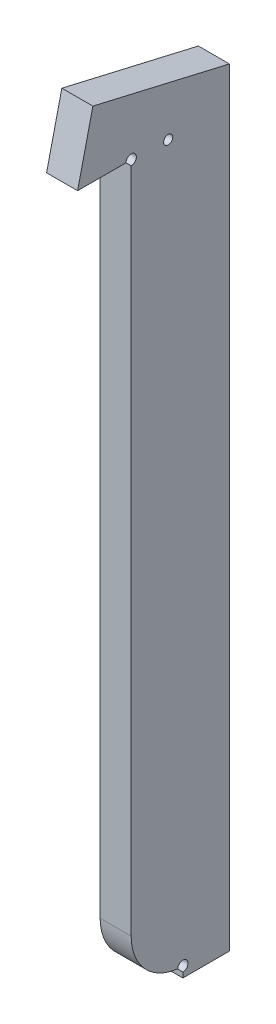
ISO-10303-21;
HEADER;
FILE_DESCRIPTION(('STEP AP214'),'2;1');
FILE_NAME('part.step','',(''),(''),'','','');
FILE_SCHEMA(('AUTOMOTIVE_DESIGN { 1 0 10303 214 1 1 1 1 }'));
ENDSEC;
DATA;
#1=APPLICATION_CONTEXT('core data for automotive mechanical design processes');
#2=APPLICATION_PROTOCOL_DEFINITION('international standard','automotive_design',2000,#1);
#3=PRODUCT_CONTEXT('',#1,'mechanical');
#4=PRODUCT('Part','Part','',(#3));
#5=PRODUCT_RELATED_PRODUCT_CATEGORY('part','',(#4));
#6=PRODUCT_DEFINITION_FORMATION('','',#4);
#7=PRODUCT_DEFINITION_CONTEXT('part definition',#1,'design');
#8=PRODUCT_DEFINITION('design','',#6,#7);
#9=PRODUCT_DEFINITION_SHAPE('','',#8);
#10=(LENGTH_UNIT() NAMED_UNIT(*) SI_UNIT(.MILLI.,.METRE.));
#11=(NAMED_UNIT(*) PLANE_ANGLE_UNIT() SI_UNIT($,.RADIAN.));
#12=(NAMED_UNIT(*) SI_UNIT($,.STERADIAN.) SOLID_ANGLE_UNIT());
#13=UNCERTAINTY_MEASURE_WITH_UNIT(LENGTH_MEASURE(1.E-05),#10,'distance_accuracy_value','');
#14=(GEOMETRIC_REPRESENTATION_CONTEXT(3) GLOBAL_UNCERTAINTY_ASSIGNED_CONTEXT((#13)) GLOBAL_UNIT_ASSIGNED_CONTEXT((#10,
#11,#12)) REPRESENTATION_CONTEXT('',''));
#15=CARTESIAN_POINT('',(0.,0.,0.));
#16=DIRECTION('',(0.,0.,1.));
#17=DIRECTION('',(1.,0.,0.));
#18=AXIS2_PLACEMENT_3D('',#15,#16,#17);
#19=CARTESIAN_POINT('',(-228.088766336441,1.77635683940025E-12,66.675));
#20=DIRECTION('',(1.,0.,0.));
#21=DIRECTION('',(0.,1.,0.));
#22=AXIS2_PLACEMENT_3D('',#19,#20,#21);
#23=PLANE('',#22);
#24=CARTESIAN_POINT('',(-228.088766336441,-0.660555348845376,37.580125219567));
#25=DIRECTION('',(-1.,0.,0.));
#26=DIRECTION('',(0.,0.,1.));
#27=AXIS2_PLACEMENT_3D('',#24,#25,#26);
#28=CIRCLE('',#27,6.35000000000002);
#29=CARTESIAN_POINT('',(-228.088766336441,-0.660555348845376,43.930125219567));
#30=VERTEX_POINT('',#29);
#31=EDGE_CURVE('E234',#30,#30,#28,.T.);
#32=ORIENTED_EDGE('',*,*,#31,.F.);
#33=EDGE_LOOP('',(#32));
#34=FACE_BOUND('',#33,.T.);
#35=DIRECTION('',(0.,-1.,0.));
#36=VECTOR('',#35,1.);
#37=CARTESIAN_POINT('',(-228.088766336441,-450.85,28.575));
#38=LINE('',#37,#36);
#39=CARTESIAN_POINT('',(-228.088766336441,-447.675,28.575));
#40=VERTEX_POINT('',#39);
#41=CARTESIAN_POINT('',(-228.088766336441,-450.85,28.575));
#42=VERTEX_POINT('',#41);
#43=EDGE_CURVE('E137',#40,#42,#38,.T.);
#44=ORIENTED_EDGE('',*,*,#43,.F.);
#45=CARTESIAN_POINT('',(-228.088766336441,-444.5,28.575));
#46=DIRECTION('',(-1.,0.,0.));
#47=DIRECTION('',(0.,0.,1.));
#48=AXIS2_PLACEMENT_3D('',#45,#46,#47);
#49=CIRCLE('',#48,3.17499999999998);
#50=CARTESIAN_POINT('',(-228.088766336441,-444.34125,31.7460287664258));
#51=VERTEX_POINT('',#50);
#52=EDGE_CURVE('E165',#51,#40,#49,.T.);
#53=ORIENTED_EDGE('',*,*,#52,.F.);
#54=CARTESIAN_POINT('',(-228.088766336441,-412.75,28.575));
#55=DIRECTION('',(1.,0.,0.));
#56=DIRECTION('',(0.,-1.,0.));
#57=AXIS2_PLACEMENT_3D('',#54,#55,#56);
#58=CIRCLE('',#57,31.75);
#59=CARTESIAN_POINT('',(-228.088766336441,-412.75,60.325));
#60=VERTEX_POINT('',#59);
#61=EDGE_CURVE('E120',#60,#51,#58,.T.);
#62=ORIENTED_EDGE('',*,*,#61,.F.);
#63=DIRECTION('',(0.,-1.,0.));
#64=VECTOR('',#63,1.);
#65=CARTESIAN_POINT('',(-228.088766336441,1.77635683940025E-12,60.325));
#66=LINE('',#65,#64);
#67=CARTESIAN_POINT('',(-228.088766336441,-3.17500000000002,60.325));
#68=VERTEX_POINT('',#67);
#69=EDGE_CURVE('E129',#68,#60,#66,.T.);
#70=ORIENTED_EDGE('',*,*,#69,.F.);
#71=CARTESIAN_POINT('',(-228.088766336441,0.,60.325));
#72=DIRECTION('',(-1.,0.,0.));
#73=DIRECTION('',(0.,0.,1.));
#74=AXIS2_PLACEMENT_3D('',#71,#72,#73);
#75=CIRCLE('',#74,3.175);
#76=CARTESIAN_POINT('',(-228.088766336441,0.,63.5));
#77=VERTEX_POINT('',#76);
#78=EDGE_CURVE('E121',#77,#68,#75,.T.);
#79=ORIENTED_EDGE('',*,*,#78,.F.);
#80=DIRECTION('',(0.,0.,1.));
#81=VECTOR('',#80,1.);
#82=CARTESIAN_POINT('',(-228.088766336441,0.,93.19619398089));
#83=LINE('',#82,#81);
#84=CARTESIAN_POINT('',(-228.088766336441,0.,93.19619398089));
#85=VERTEX_POINT('',#84);
#86=EDGE_CURVE('E179',#77,#85,#83,.T.);
#87=ORIENTED_EDGE('',*,*,#86,.T.);
#88=DIRECTION('',(0.,0.974040610761285,-0.226373338950908));
#89=VECTOR('',#88,1.);
#90=CARTESIAN_POINT('',(-228.088766336441,40.3069419106845,83.8285999376698));
#91=LINE('',#90,#89);
#92=CARTESIAN_POINT('',(-228.088766336441,40.3069419106845,83.8285999376698));
#93=VERTEX_POINT('',#92);
#94=EDGE_CURVE('E182',#85,#93,#91,.T.);
#95=ORIENTED_EDGE('',*,*,#94,.T.);
#96=DIRECTION('',(0.,-0.226373338950912,-0.974040610761284));
#97=VECTOR('',#96,1.);
#98=CARTESIAN_POINT('',(-228.088766336441,34.844553241799,60.325));
#99=LINE('',#98,#97);
#100=CARTESIAN_POINT('',(-228.088766336441,20.8246330030108,0.));
#101=VERTEX_POINT('',#100);
#102=EDGE_CURVE('E192',#93,#101,#99,.T.);
#103=ORIENTED_EDGE('',*,*,#102,.T.);
#104=DIRECTION('',(0.,-1.,0.));
#105=VECTOR('',#104,1.);
#106=CARTESIAN_POINT('',(-228.088766336441,1.77635683940025E-12,0.));
#107=LINE('',#106,#105);
#108=CARTESIAN_POINT('',(-228.088766336441,-450.85,0.));
#109=VERTEX_POINT('',#108);
#110=EDGE_CURVE('E141',#101,#109,#107,.T.);
#111=ORIENTED_EDGE('',*,*,#110,.T.);
#112=DIRECTION('',(0.,0.,-1.));
#113=VECTOR('',#112,1.);
#114=CARTESIAN_POINT('',(-228.088766336441,-450.85,66.675));
#115=LINE('',#114,#113);
#116=EDGE_CURVE('E151',#42,#109,#115,.T.);
#117=ORIENTED_EDGE('',*,*,#116,.F.);
#118=EDGE_LOOP('',(#44,#53,#62,#70,#79,#87,#95,#103,#111,#117));
#119=FACE_BOUND('',#118,.T.);
#120=ADVANCED_FACE('F33',(#34,#119),#23,.F.);
#121=CARTESIAN_POINT('',(-228.088766336441,-450.85,66.675));
#122=DIRECTION('',(0.,1.,0.));
#123=DIRECTION('',(0.,0.,1.));
#124=AXIS2_PLACEMENT_3D('',#121,#122,#123);
#125=PLANE('',#124);
#126=DIRECTION('',(0.,0.,-1.));
#127=VECTOR('',#126,1.);
#128=CARTESIAN_POINT('',(-209.038766336441,-450.85,66.675));
#129=LINE('',#128,#127);
#130=CARTESIAN_POINT('',(-209.038766336441,-450.85,28.575));
#131=VERTEX_POINT('',#130);
#132=CARTESIAN_POINT('',(-209.038766336441,-450.85,0.));
#133=VERTEX_POINT('',#132);
#134=EDGE_CURVE('E149',#131,#133,#129,.T.);
#135=ORIENTED_EDGE('',*,*,#134,.F.);
#136=DIRECTION('',(1.,0.,0.));
#137=VECTOR('',#136,1.);
#138=CARTESIAN_POINT('',(-228.088766336441,-450.85,28.575));
#139=LINE('',#138,#137);
#140=EDGE_CURVE('E153',#131,#42,#139,.F.);
#141=ORIENTED_EDGE('',*,*,#140,.T.);
#142=ORIENTED_EDGE('',*,*,#116,.T.);
#143=DIRECTION('',(1.,0.,0.));
#144=VECTOR('',#143,1.);
#145=CARTESIAN_POINT('',(-228.088766336441,-450.85,0.));
#146=LINE('',#145,#144);
#147=EDGE_CURVE('E144',#109,#133,#146,.T.);
#148=ORIENTED_EDGE('',*,*,#147,.T.);
#149=EDGE_LOOP('',(#135,#141,#142,#148));
#150=FACE_BOUND('',#149,.T.);
#151=ADVANCED_FACE('F215',(#150),#125,.F.);
#152=CARTESIAN_POINT('',(-209.038766336441,0.,66.675));
#153=DIRECTION('',(-1.,0.,0.));
#154=DIRECTION('',(0.,-1.,0.));
#155=AXIS2_PLACEMENT_3D('',#152,#153,#154);
#156=PLANE('',#155);
#157=CARTESIAN_POINT('',(-209.038766336441,-0.660555348845376,37.580125219567));
#158=DIRECTION('',(-1.,0.,0.));
#159=DIRECTION('',(0.,-1.,0.));
#160=AXIS2_PLACEMENT_3D('',#157,#158,#159);
#161=CIRCLE('',#160,2.80670000000001);
#162=CARTESIAN_POINT('',(-209.038766336441,-3.46725534884539,37.580125219567));
#163=VERTEX_POINT('',#162);
#164=EDGE_CURVE('E167',#163,#163,#161,.T.);
#165=ORIENTED_EDGE('',*,*,#164,.T.);
#166=EDGE_LOOP('',(#165));
#167=FACE_BOUND('',#166,.T.);
#168=CARTESIAN_POINT('',(-209.038766336441,-412.75,28.575));
#169=DIRECTION('',(-1.,0.,0.));
#170=DIRECTION('',(0.,-1.,0.));
#171=AXIS2_PLACEMENT_3D('',#168,#169,#170);
#172=CIRCLE('',#171,31.75);
#173=CARTESIAN_POINT('',(-209.038766336441,-444.34125,31.7460287664258));
#174=VERTEX_POINT('',#173);
#175=CARTESIAN_POINT('',(-209.038766336441,-412.75,60.325));
#176=VERTEX_POINT('',#175);
#177=EDGE_CURVE('E117',#174,#176,#172,.T.);
#178=ORIENTED_EDGE('',*,*,#177,.F.);
#179=CARTESIAN_POINT('',(-209.038766336441,-444.5,28.575));
#180=DIRECTION('',(-1.,0.,0.));
#181=DIRECTION('',(0.,-1.,0.));
#182=AXIS2_PLACEMENT_3D('',#179,#180,#181);
#183=CIRCLE('',#182,3.17499999999998);
#184=CARTESIAN_POINT('',(-209.038766336441,-447.675,28.575));
#185=VERTEX_POINT('',#184);
#186=EDGE_CURVE('E11',#174,#185,#183,.T.);
#187=ORIENTED_EDGE('',*,*,#186,.T.);
#188=DIRECTION('',(0.,1.,0.));
#189=VECTOR('',#188,1.);
#190=CARTESIAN_POINT('',(-209.038766336441,-450.85,28.575));
#191=LINE('',#190,#189);
#192=EDGE_CURVE('E127',#131,#185,#191,.T.);
#193=ORIENTED_EDGE('',*,*,#192,.F.);
#194=ORIENTED_EDGE('',*,*,#134,.T.);
#195=DIRECTION('',(0.,1.,0.));
#196=VECTOR('',#195,1.);
#197=CARTESIAN_POINT('',(-209.038766336441,0.,0.));
#198=LINE('',#197,#196);
#199=CARTESIAN_POINT('',(-209.038766336441,20.8246330030108,0.));
#200=VERTEX_POINT('',#199);
#201=EDGE_CURVE('E147',#133,#200,#198,.T.);
#202=ORIENTED_EDGE('',*,*,#201,.T.);
#203=DIRECTION('',(0.,-0.226373338950912,-0.974040610761284));
#204=VECTOR('',#203,1.);
#205=CARTESIAN_POINT('',(-209.038766336441,34.844553241799,60.325));
#206=LINE('',#205,#204);
#207=CARTESIAN_POINT('',(-209.038766336441,40.3069419106845,83.8285999376698));
#208=VERTEX_POINT('',#207);
#209=EDGE_CURVE('E195',#208,#200,#206,.T.);
#210=ORIENTED_EDGE('',*,*,#209,.F.);
#211=DIRECTION('',(0.,0.974040610761285,-0.226373338950908));
#212=VECTOR('',#211,1.);
#213=CARTESIAN_POINT('',(-209.038766336441,40.3069419106845,83.8285999376698));
#214=LINE('',#213,#212);
#215=CARTESIAN_POINT('',(-209.038766336441,0.,93.19619398089));
#216=VERTEX_POINT('',#215);
#217=EDGE_CURVE('E181',#216,#208,#214,.T.);
#218=ORIENTED_EDGE('',*,*,#217,.F.);
#219=DIRECTION('',(0.,0.,1.));
#220=VECTOR('',#219,1.);
#221=CARTESIAN_POINT('',(-209.038766336441,0.,93.19619398089));
#222=LINE('',#221,#220);
#223=CARTESIAN_POINT('',(-209.038766336441,1.00223476074274E-12,63.5));
#224=VERTEX_POINT('',#223);
#225=EDGE_CURVE('E157',#224,#216,#222,.T.);
#226=ORIENTED_EDGE('',*,*,#225,.F.);
#227=CARTESIAN_POINT('',(-209.038766336441,0.,60.325));
#228=DIRECTION('',(-1.,0.,0.));
#229=DIRECTION('',(0.,-1.,0.));
#230=AXIS2_PLACEMENT_3D('',#227,#228,#229);
#231=CIRCLE('',#230,3.175);
#232=CARTESIAN_POINT('',(-209.038766336441,-3.17500000000002,60.325));
#233=VERTEX_POINT('',#232);
#234=EDGE_CURVE('E40',#224,#233,#231,.T.);
#235=ORIENTED_EDGE('',*,*,#234,.T.);
#236=DIRECTION('',(0.,1.,0.));
#237=VECTOR('',#236,1.);
#238=CARTESIAN_POINT('',(-209.038766336441,1.77870238100157E-12,60.325));
#239=LINE('',#238,#237);
#240=EDGE_CURVE('E126',#176,#233,#239,.T.);
#241=ORIENTED_EDGE('',*,*,#240,.F.);
#242=EDGE_LOOP('',(#178,#187,#193,#194,#202,#210,#218,#226,#235,#241));
#243=FACE_BOUND('',#242,.T.);
#244=ADVANCED_FACE('F124',(#167,#243),#156,.F.);
#245=CARTESIAN_POINT('',(0.,0.,0.));
#246=DIRECTION('',(0.,0.,1.));
#247=DIRECTION('',(1.,0.,0.));
#248=AXIS2_PLACEMENT_3D('',#245,#246,#247);
#249=PLANE('',#248);
#250=ORIENTED_EDGE('',*,*,#110,.F.);
#251=DIRECTION('',(-1.,0.,0.));
#252=VECTOR('',#251,1.);
#253=CARTESIAN_POINT('',(-209.038766336441,20.8246330030108,0.));
#254=LINE('',#253,#252);
#255=EDGE_CURVE('E131',#200,#101,#254,.T.);
#256=ORIENTED_EDGE('',*,*,#255,.F.);
#257=ORIENTED_EDGE('',*,*,#201,.F.);
#258=ORIENTED_EDGE('',*,*,#147,.F.);
#259=EDGE_LOOP('',(#250,#256,#257,#258));
#260=FACE_BOUND('',#259,.T.);
#261=ADVANCED_FACE('F213',(#260),#249,.F.);
#262=CARTESIAN_POINT('',(-209.037766336441,-450.85,28.575));
#263=DIRECTION('',(0.,0.,-1.));
#264=DIRECTION('',(0.,1.,0.));
#265=AXIS2_PLACEMENT_3D('',#262,#263,#264);
#266=PLANE('',#265);
#267=ORIENTED_EDGE('',*,*,#192,.T.);
#268=DIRECTION('',(-1.,0.,0.));
#269=VECTOR('',#268,1.);
#270=CARTESIAN_POINT('',(-228.088766336441,-447.675,28.575));
#271=LINE('',#270,#269);
#272=EDGE_CURVE('E47',#185,#40,#271,.T.);
#273=ORIENTED_EDGE('',*,*,#272,.T.);
#274=ORIENTED_EDGE('',*,*,#43,.T.);
#275=ORIENTED_EDGE('',*,*,#140,.F.);
#276=EDGE_LOOP('',(#267,#273,#274,#275));
#277=FACE_BOUND('',#276,.T.);
#278=ADVANCED_FACE('F217',(#277),#266,.F.);
#279=CARTESIAN_POINT('',(-209.037766336441,-412.75,28.575));
#280=DIRECTION('',(-1.,0.,0.));
#281=DIRECTION('',(0.,-1.,0.));
#282=AXIS2_PLACEMENT_3D('',#279,#280,#281);
#283=CYLINDRICAL_SURFACE('',#282,31.75);
#284=ORIENTED_EDGE('',*,*,#61,.T.);
#285=DIRECTION('',(-1.,0.,0.));
#286=VECTOR('',#285,1.);
#287=CARTESIAN_POINT('',(-218.563766336441,-444.34125,31.7460287664258));
#288=LINE('',#287,#286);
#289=EDGE_CURVE('E107',#51,#174,#288,.F.);
#290=ORIENTED_EDGE('',*,*,#289,.T.);
#291=ORIENTED_EDGE('',*,*,#177,.T.);
#292=DIRECTION('',(-1.,0.,0.));
#293=VECTOR('',#292,1.);
#294=CARTESIAN_POINT('',(-209.037766336441,-412.75,60.325));
#295=LINE('',#294,#293);
#296=EDGE_CURVE('E139',#176,#60,#295,.T.);
#297=ORIENTED_EDGE('',*,*,#296,.T.);
#298=EDGE_LOOP('',(#284,#290,#291,#297));
#299=FACE_BOUND('',#298,.T.);
#300=ADVANCED_FACE('F115',(#299),#283,.T.);
#301=CARTESIAN_POINT('',(-209.037766336441,1.77870250412711E-12,60.325));
#302=DIRECTION('',(0.,0.,-1.));
#303=DIRECTION('',(0.,1.,0.));
#304=AXIS2_PLACEMENT_3D('',#301,#302,#303);
#305=PLANE('',#304);
#306=ORIENTED_EDGE('',*,*,#240,.T.);
#307=DIRECTION('',(-1.,0.,0.));
#308=VECTOR('',#307,1.);
#309=CARTESIAN_POINT('',(-228.088766336441,-3.17500000000002,60.325));
#310=LINE('',#309,#308);
#311=EDGE_CURVE('E54',#233,#68,#310,.T.);
#312=ORIENTED_EDGE('',*,*,#311,.T.);
#313=ORIENTED_EDGE('',*,*,#69,.T.);
#314=ORIENTED_EDGE('',*,*,#296,.F.);
#315=EDGE_LOOP('',(#306,#312,#313,#314));
#316=FACE_BOUND('',#315,.T.);
#317=ADVANCED_FACE('F160',(#316),#305,.F.);
#318=CARTESIAN_POINT('',(-209.038766336441,34.844553241799,60.325));
#319=DIRECTION('',(0.,0.974040610761284,-0.226373338950912));
#320=DIRECTION('',(0.,0.226373338950912,0.974040610761284));
#321=AXIS2_PLACEMENT_3D('',#318,#319,#320);
#322=PLANE('',#321);
#323=ORIENTED_EDGE('',*,*,#102,.F.);
#324=DIRECTION('',(-1.,0.,0.));
#325=VECTOR('',#324,1.);
#326=CARTESIAN_POINT('',(-209.038766336441,40.3069419106845,83.8285999376698));
#327=LINE('',#326,#325);
#328=EDGE_CURVE('E189',#208,#93,#327,.T.);
#329=ORIENTED_EDGE('',*,*,#328,.F.);
#330=ORIENTED_EDGE('',*,*,#209,.T.);
#331=ORIENTED_EDGE('',*,*,#255,.T.);
#332=EDGE_LOOP('',(#323,#329,#330,#331));
#333=FACE_BOUND('',#332,.T.);
#334=ADVANCED_FACE('F202',(#333),#322,.T.);
#335=CARTESIAN_POINT('',(-209.038766336441,40.3069419106845,83.8285999376698));
#336=DIRECTION('',(0.,0.226373338950908,0.974040610761285));
#337=DIRECTION('',(0.,-0.974040610761285,0.226373338950908));
#338=AXIS2_PLACEMENT_3D('',#335,#336,#337);
#339=PLANE('',#338);
#340=ORIENTED_EDGE('',*,*,#94,.F.);
#341=DIRECTION('',(-1.,0.,0.));
#342=VECTOR('',#341,1.);
#343=CARTESIAN_POINT('',(-209.038766336441,0.,93.19619398089));
#344=LINE('',#343,#342);
#345=EDGE_CURVE('E185',#216,#85,#344,.T.);
#346=ORIENTED_EDGE('',*,*,#345,.F.);
#347=ORIENTED_EDGE('',*,*,#217,.T.);
#348=ORIENTED_EDGE('',*,*,#328,.T.);
#349=EDGE_LOOP('',(#340,#346,#347,#348));
#350=FACE_BOUND('',#349,.T.);
#351=ADVANCED_FACE('F210',(#350),#339,.T.);
#352=CARTESIAN_POINT('',(-209.038766336441,0.,93.19619398089));
#353=DIRECTION('',(0.,-1.,0.));
#354=DIRECTION('',(0.,0.,-1.));
#355=AXIS2_PLACEMENT_3D('',#352,#353,#354);
#356=PLANE('',#355);
#357=DIRECTION('',(-1.,0.,0.));
#358=VECTOR('',#357,1.);
#359=CARTESIAN_POINT('',(-228.088766336441,9.99889219141416E-13,63.5));
#360=LINE('',#359,#358);
#361=EDGE_CURVE('E176',#224,#77,#360,.T.);
#362=ORIENTED_EDGE('',*,*,#361,.F.);
#363=ORIENTED_EDGE('',*,*,#225,.T.);
#364=ORIENTED_EDGE('',*,*,#345,.T.);
#365=ORIENTED_EDGE('',*,*,#86,.F.);
#366=EDGE_LOOP('',(#362,#363,#364,#365));
#367=FACE_BOUND('',#366,.T.);
#368=ADVANCED_FACE('F265',(#367),#356,.T.);
#369=CARTESIAN_POINT('',(-228.088766336441,0.,60.325));
#370=DIRECTION('',(-1.,0.,0.));
#371=DIRECTION('',(0.,0.,1.));
#372=AXIS2_PLACEMENT_3D('',#369,#370,#371);
#373=CYLINDRICAL_SURFACE('',#372,3.175);
#374=ORIENTED_EDGE('',*,*,#234,.F.);
#375=ORIENTED_EDGE('',*,*,#361,.T.);
#376=ORIENTED_EDGE('',*,*,#78,.T.);
#377=ORIENTED_EDGE('',*,*,#311,.F.);
#378=EDGE_LOOP('',(#374,#375,#376,#377));
#379=FACE_BOUND('',#378,.T.);
#380=ADVANCED_FACE('F262',(#379),#373,.F.);
#381=CARTESIAN_POINT('',(-228.088766336441,-444.5,28.575));
#382=DIRECTION('',(-1.,0.,0.));
#383=DIRECTION('',(0.,0.,1.));
#384=AXIS2_PLACEMENT_3D('',#381,#382,#383);
#385=CYLINDRICAL_SURFACE('',#384,3.17499999999998);
#386=ORIENTED_EDGE('',*,*,#52,.T.);
#387=ORIENTED_EDGE('',*,*,#272,.F.);
#388=ORIENTED_EDGE('',*,*,#186,.F.);
#389=ORIENTED_EDGE('',*,*,#289,.F.);
#390=EDGE_LOOP('',(#386,#387,#388,#389));
#391=FACE_BOUND('',#390,.T.);
#392=ADVANCED_FACE('F106',(#391),#385,.F.);
#393=CARTESIAN_POINT('',(-228.088766336441,-0.660555348845376,37.580125219567));
#394=DIRECTION('',(-1.,0.,0.));
#395=DIRECTION('',(0.,0.,1.));
#396=AXIS2_PLACEMENT_3D('',#393,#394,#395);
#397=CYLINDRICAL_SURFACE('',#396,2.80670000000001);
#398=ORIENTED_EDGE('',*,*,#164,.F.);
#399=EDGE_LOOP('',(#398));
#400=FACE_BOUND('',#399,.T.);
#401=CARTESIAN_POINT('',(-221.738766336441,-0.660555348845376,37.580125219567));
#402=DIRECTION('',(-1.,0.,0.));
#403=DIRECTION('',(0.,0.,1.));
#404=AXIS2_PLACEMENT_3D('',#401,#402,#403);
#405=CIRCLE('',#404,2.80670000000001);
#406=CARTESIAN_POINT('',(-221.738766336441,-0.660555348845376,40.386825219567));
#407=VERTEX_POINT('',#406);
#408=EDGE_CURVE('E171',#407,#407,#405,.T.);
#409=ORIENTED_EDGE('',*,*,#408,.T.);
#410=EDGE_LOOP('',(#409));
#411=FACE_BOUND('',#410,.T.);
#412=ADVANCED_FACE('F243',(#400,#411),#397,.F.);
#413=CARTESIAN_POINT('',(-221.738766336441,2.14614465115464,37.580125219567));
#414=DIRECTION('',(1.,0.,0.));
#415=DIRECTION('',(0.,0.,-1.));
#416=AXIS2_PLACEMENT_3D('',#413,#414,#415);
#417=PLANE('',#416);
#418=ORIENTED_EDGE('',*,*,#408,.F.);
#419=EDGE_LOOP('',(#418));
#420=FACE_BOUND('',#419,.T.);
#421=CARTESIAN_POINT('',(-221.738766336441,-0.660555348845376,37.580125219567));
#422=DIRECTION('',(-1.,0.,0.));
#423=DIRECTION('',(0.,0.,1.));
#424=AXIS2_PLACEMENT_3D('',#421,#422,#423);
#425=CIRCLE('',#424,6.35000000000001);
#426=CARTESIAN_POINT('',(-221.738766336441,-0.660555348845376,43.930125219567));
#427=VERTEX_POINT('',#426);
#428=EDGE_CURVE('E236',#427,#427,#425,.T.);
#429=ORIENTED_EDGE('',*,*,#428,.T.);
#430=EDGE_LOOP('',(#429));
#431=FACE_BOUND('',#430,.T.);
#432=ADVANCED_FACE('F245',(#420,#431),#417,.F.);
#433=CARTESIAN_POINT('',(-228.088766336441,-0.660555348845376,37.580125219567));
#434=DIRECTION('',(-1.,0.,0.));
#435=DIRECTION('',(0.,0.,1.));
#436=AXIS2_PLACEMENT_3D('',#433,#434,#435);
#437=CYLINDRICAL_SURFACE('',#436,6.35000000000001);
#438=ORIENTED_EDGE('',*,*,#428,.F.);
#439=EDGE_LOOP('',(#438));
#440=FACE_BOUND('',#439,.T.);
#441=ORIENTED_EDGE('',*,*,#31,.T.);
#442=EDGE_LOOP('',(#441));
#443=FACE_BOUND('',#442,.T.);
#444=ADVANCED_FACE('F248',(#440,#443),#437,.F.);
#445=CLOSED_SHELL('',(#120,#151,#244,#261,#278,#300,#317,#334,#351,#368,#380,#392,#412,#432,#444));
#446=MANIFOLD_SOLID_BREP('B2',#445);
#447=ADVANCED_BREP_SHAPE_REPRESENTATION('',(#18,#446),#14);
#448=SHAPE_DEFINITION_REPRESENTATION(#9,#447);
ENDSEC;
END-ISO-10303-21;
